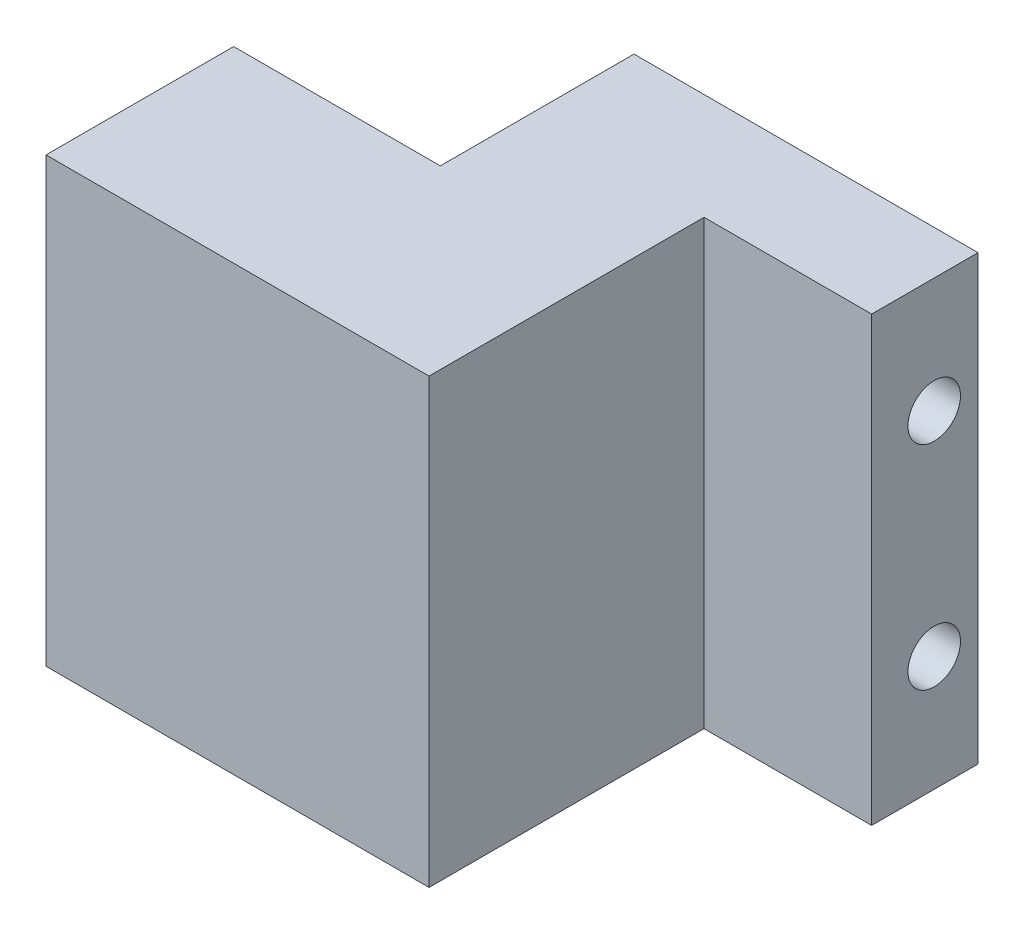
ISO-10303-21;
HEADER;
FILE_DESCRIPTION(('STEP AP214'),'2;1');
FILE_NAME('part.step','',(''),(''),'','','');
FILE_SCHEMA(('AUTOMOTIVE_DESIGN { 1 0 10303 214 1 1 1 1 }'));
ENDSEC;
DATA;
#1=APPLICATION_CONTEXT('core data for automotive mechanical design processes');
#2=APPLICATION_PROTOCOL_DEFINITION('international standard','automotive_design',2000,#1);
#3=PRODUCT_CONTEXT('',#1,'mechanical');
#4=PRODUCT('Part','Part','',(#3));
#5=PRODUCT_RELATED_PRODUCT_CATEGORY('part','',(#4));
#6=PRODUCT_DEFINITION_FORMATION('','',#4);
#7=PRODUCT_DEFINITION_CONTEXT('part definition',#1,'design');
#8=PRODUCT_DEFINITION('design','',#6,#7);
#9=PRODUCT_DEFINITION_SHAPE('','',#8);
#10=(LENGTH_UNIT() NAMED_UNIT(*) SI_UNIT(.MILLI.,.METRE.));
#11=(NAMED_UNIT(*) PLANE_ANGLE_UNIT() SI_UNIT($,.RADIAN.));
#12=(NAMED_UNIT(*) SI_UNIT($,.STERADIAN.) SOLID_ANGLE_UNIT());
#13=UNCERTAINTY_MEASURE_WITH_UNIT(LENGTH_MEASURE(1.E-05),#10,'distance_accuracy_value','');
#14=(GEOMETRIC_REPRESENTATION_CONTEXT(3) GLOBAL_UNCERTAINTY_ASSIGNED_CONTEXT((#13)) GLOBAL_UNIT_ASSIGNED_CONTEXT((#10,
#11,#12)) REPRESENTATION_CONTEXT('',''));
#15=CARTESIAN_POINT('',(0.,0.,0.));
#16=DIRECTION('',(0.,0.,1.));
#17=DIRECTION('',(1.,0.,0.));
#18=AXIS2_PLACEMENT_3D('',#15,#16,#17);
#19=CARTESIAN_POINT('',(1.01739170034459,35.4,-0.479999999999997));
#20=DIRECTION('',(-1.,0.,0.));
#21=DIRECTION('',(0.,0.,1.));
#22=AXIS2_PLACEMENT_3D('',#19,#20,#21);
#23=PLANE('',#22);
#24=DIRECTION('',(0.,0.,-1.));
#25=VECTOR('',#24,1.);
#26=CARTESIAN_POINT('',(1.01739170034459,0.,-0.479999999999997));
#27=LINE('',#26,#25);
#28=CARTESIAN_POINT('',(1.01739170034459,0.,8.02));
#29=VERTEX_POINT('',#28);
#30=CARTESIAN_POINT('',(1.01739170034459,0.,-0.479999999999997));
#31=VERTEX_POINT('',#30);
#32=EDGE_CURVE('E147',#29,#31,#27,.T.);
#33=ORIENTED_EDGE('',*,*,#32,.T.);
#34=DIRECTION('',(0.,-1.,0.));
#35=VECTOR('',#34,1.);
#36=CARTESIAN_POINT('',(1.01739170034459,35.4,-0.479999999999997));
#37=LINE('',#36,#35);
#38=CARTESIAN_POINT('',(1.01739170034459,35.4,-0.479999999999997));
#39=VERTEX_POINT('',#38);
#40=EDGE_CURVE('E41',#39,#31,#37,.T.);
#41=ORIENTED_EDGE('',*,*,#40,.F.);
#42=DIRECTION('',(0.,0.,-1.));
#43=VECTOR('',#42,1.);
#44=CARTESIAN_POINT('',(1.01739170034459,35.4,-0.479999999999997));
#45=LINE('',#44,#43);
#46=CARTESIAN_POINT('',(1.01739170034459,35.4,8.02));
#47=VERTEX_POINT('',#46);
#48=EDGE_CURVE('E100',#47,#39,#45,.T.);
#49=ORIENTED_EDGE('',*,*,#48,.F.);
#50=DIRECTION('',(0.,-1.,0.));
#51=VECTOR('',#50,1.);
#52=CARTESIAN_POINT('',(1.01739170034459,35.4,8.02));
#53=LINE('',#52,#51);
#54=EDGE_CURVE('E11',#47,#29,#53,.T.);
#55=ORIENTED_EDGE('',*,*,#54,.T.);
#56=EDGE_LOOP('',(#33,#41,#49,#55));
#57=FACE_BOUND('',#56,.T.);
#58=CARTESIAN_POINT('',(1.01739170034459,26.2,3.02));
#59=DIRECTION('',(1.,0.,0.));
#60=DIRECTION('',(0.,0.,-1.));
#61=AXIS2_PLACEMENT_3D('',#58,#59,#60);
#62=CIRCLE('',#61,2.1);
#63=CARTESIAN_POINT('',(1.01739170034459,26.2,0.920000000000002));
#64=VERTEX_POINT('',#63);
#65=EDGE_CURVE('E180',#64,#64,#62,.F.);
#66=ORIENTED_EDGE('',*,*,#65,.T.);
#67=EDGE_LOOP('',(#66));
#68=FACE_BOUND('',#67,.T.);
#69=CARTESIAN_POINT('',(1.01739170034459,9.2,3.02));
#70=DIRECTION('',(1.,0.,0.));
#71=DIRECTION('',(0.,0.,-1.));
#72=AXIS2_PLACEMENT_3D('',#69,#70,#71);
#73=CIRCLE('',#72,2.1);
#74=CARTESIAN_POINT('',(1.01739170034459,9.2,0.920000000000002));
#75=VERTEX_POINT('',#74);
#76=EDGE_CURVE('E175',#75,#75,#73,.T.);
#77=ORIENTED_EDGE('',*,*,#76,.F.);
#78=EDGE_LOOP('',(#77));
#79=FACE_BOUND('',#78,.T.);
#80=ADVANCED_FACE('F33',(#57,#68,#79),#23,.F.);
#81=CARTESIAN_POINT('',(-26.48,35.4,15.));
#82=DIRECTION('',(1.,0.,0.));
#83=DIRECTION('',(0.,0.,-1.));
#84=AXIS2_PLACEMENT_3D('',#81,#82,#83);
#85=PLANE('',#84);
#86=DIRECTION('',(0.,0.,1.));
#87=VECTOR('',#86,1.);
#88=CARTESIAN_POINT('',(-26.48,0.,15.));
#89=LINE('',#88,#87);
#90=CARTESIAN_POINT('',(-26.4799999999999,0.,-0.479999999999993));
#91=VERTEX_POINT('',#90);
#92=CARTESIAN_POINT('',(-26.48,0.,15.));
#93=VERTEX_POINT('',#92);
#94=EDGE_CURVE('E152',#91,#93,#89,.T.);
#95=ORIENTED_EDGE('',*,*,#94,.T.);
#96=DIRECTION('',(0.,-1.,0.));
#97=VECTOR('',#96,1.);
#98=CARTESIAN_POINT('',(-26.48,35.4,15.));
#99=LINE('',#98,#97);
#100=CARTESIAN_POINT('',(-26.48,35.4,15.));
#101=VERTEX_POINT('',#100);
#102=EDGE_CURVE('E166',#101,#93,#99,.T.);
#103=ORIENTED_EDGE('',*,*,#102,.F.);
#104=DIRECTION('',(0.,0.,1.));
#105=VECTOR('',#104,1.);
#106=CARTESIAN_POINT('',(-26.48,35.4,15.));
#107=LINE('',#106,#105);
#108=CARTESIAN_POINT('',(-26.4799999999999,35.4,-0.479999999999993));
#109=VERTEX_POINT('',#108);
#110=EDGE_CURVE('E222',#109,#101,#107,.T.);
#111=ORIENTED_EDGE('',*,*,#110,.F.);
#112=DIRECTION('',(0.,-1.,0.));
#113=VECTOR('',#112,1.);
#114=CARTESIAN_POINT('',(-26.4799999999999,35.4,-0.479999999999993));
#115=LINE('',#114,#113);
#116=EDGE_CURVE('E169',#109,#91,#115,.T.);
#117=ORIENTED_EDGE('',*,*,#116,.T.);
#118=EDGE_LOOP('',(#95,#103,#111,#117));
#119=FACE_BOUND('',#118,.T.);
#120=CARTESIAN_POINT('',(-26.4799999999999,26.2,3.02));
#121=DIRECTION('',(1.,0.,0.));
#122=DIRECTION('',(0.,0.,-1.));
#123=AXIS2_PLACEMENT_3D('',#120,#121,#122);
#124=CIRCLE('',#123,2.1);
#125=CARTESIAN_POINT('',(-26.4799999999999,26.2,0.920000000000002));
#126=VERTEX_POINT('',#125);
#127=EDGE_CURVE('E173',#126,#126,#124,.F.);
#128=ORIENTED_EDGE('',*,*,#127,.F.);
#129=EDGE_LOOP('',(#128));
#130=FACE_BOUND('',#129,.T.);
#131=CARTESIAN_POINT('',(-26.4799999999999,9.2,3.02));
#132=DIRECTION('',(1.,0.,0.));
#133=DIRECTION('',(0.,0.,-1.));
#134=AXIS2_PLACEMENT_3D('',#131,#132,#133);
#135=CIRCLE('',#134,2.1);
#136=CARTESIAN_POINT('',(-26.4799999999999,9.2,0.920000000000002));
#137=VERTEX_POINT('',#136);
#138=EDGE_CURVE('E36',#137,#137,#135,.T.);
#139=ORIENTED_EDGE('',*,*,#138,.T.);
#140=EDGE_LOOP('',(#139));
#141=FACE_BOUND('',#140,.T.);
#142=ADVANCED_FACE('F228',(#119,#130,#141),#85,.F.);
#143=CARTESIAN_POINT('',(1.01739170034459,35.4,-0.479999999999997));
#144=DIRECTION('',(0.,0.,1.));
#145=DIRECTION('',(1.,0.,0.));
#146=AXIS2_PLACEMENT_3D('',#143,#144,#145);
#147=PLANE('',#146);
#148=DIRECTION('',(-1.,0.,0.));
#149=VECTOR('',#148,1.);
#150=CARTESIAN_POINT('',(1.01739170034459,0.,-0.479999999999997));
#151=LINE('',#150,#149);
#152=EDGE_CURVE('E149',#31,#91,#151,.T.);
#153=ORIENTED_EDGE('',*,*,#152,.T.);
#154=ORIENTED_EDGE('',*,*,#116,.F.);
#155=DIRECTION('',(-1.,0.,0.));
#156=VECTOR('',#155,1.);
#157=CARTESIAN_POINT('',(1.01739170034459,35.4,-0.479999999999997));
#158=LINE('',#157,#156);
#159=EDGE_CURVE('E220',#39,#109,#158,.T.);
#160=ORIENTED_EDGE('',*,*,#159,.F.);
#161=ORIENTED_EDGE('',*,*,#40,.T.);
#162=EDGE_LOOP('',(#153,#154,#160,#161));
#163=FACE_BOUND('',#162,.T.);
#164=ADVANCED_FACE('F242',(#163),#147,.F.);
#165=CARTESIAN_POINT('',(-31.48,35.4,15.));
#166=DIRECTION('',(0.,0.,1.));
#167=DIRECTION('',(1.,0.,0.));
#168=AXIS2_PLACEMENT_3D('',#165,#166,#167);
#169=PLANE('',#168);
#170=DIRECTION('',(-1.,0.,0.));
#171=VECTOR('',#170,1.);
#172=CARTESIAN_POINT('',(-31.48,0.,15.));
#173=LINE('',#172,#171);
#174=CARTESIAN_POINT('',(-43.,0.,15.));
#175=VERTEX_POINT('',#174);
#176=EDGE_CURVE('E155',#93,#175,#173,.T.);
#177=ORIENTED_EDGE('',*,*,#176,.T.);
#178=DIRECTION('',(0.,-1.,0.));
#179=VECTOR('',#178,1.);
#180=CARTESIAN_POINT('',(-43.,35.4,15.));
#181=LINE('',#180,#179);
#182=CARTESIAN_POINT('',(-43.,35.4,15.));
#183=VERTEX_POINT('',#182);
#184=EDGE_CURVE('E136',#183,#175,#181,.T.);
#185=ORIENTED_EDGE('',*,*,#184,.F.);
#186=DIRECTION('',(-1.,0.,0.));
#187=VECTOR('',#186,1.);
#188=CARTESIAN_POINT('',(-31.48,35.4,15.));
#189=LINE('',#188,#187);
#190=EDGE_CURVE('E124',#101,#183,#189,.T.);
#191=ORIENTED_EDGE('',*,*,#190,.F.);
#192=ORIENTED_EDGE('',*,*,#102,.T.);
#193=EDGE_LOOP('',(#177,#185,#191,#192));
#194=FACE_BOUND('',#193,.T.);
#195=ADVANCED_FACE('F232',(#194),#169,.F.);
#196=CARTESIAN_POINT('',(-43.,35.4,15.));
#197=DIRECTION('',(1.,0.,0.));
#198=DIRECTION('',(0.,0.,-1.));
#199=AXIS2_PLACEMENT_3D('',#196,#197,#198);
#200=PLANE('',#199);
#201=DIRECTION('',(0.,0.,1.));
#202=VECTOR('',#201,1.);
#203=CARTESIAN_POINT('',(-42.9999999999999,4.92500000000001,26.815));
#204=LINE('',#203,#202);
#205=CARTESIAN_POINT('',(-43.,4.92500000000001,18.185));
#206=VERTEX_POINT('',#205);
#207=CARTESIAN_POINT('',(-42.9999999999999,4.92500000000001,26.815));
#208=VERTEX_POINT('',#207);
#209=EDGE_CURVE('E202',#206,#208,#204,.T.);
#210=ORIENTED_EDGE('',*,*,#209,.F.);
#211=DIRECTION('',(0.,-1.,0.));
#212=VECTOR('',#211,1.);
#213=CARTESIAN_POINT('',(-42.9999999999999,4.92500000000001,18.185));
#214=LINE('',#213,#212);
#215=CARTESIAN_POINT('',(-42.9999999999999,30.475,18.185));
#216=VERTEX_POINT('',#215);
#217=EDGE_CURVE('E49',#216,#206,#214,.T.);
#218=ORIENTED_EDGE('',*,*,#217,.F.);
#219=DIRECTION('',(0.,0.,-1.));
#220=VECTOR('',#219,1.);
#221=CARTESIAN_POINT('',(-42.9999999999999,30.475,26.815));
#222=LINE('',#221,#220);
#223=CARTESIAN_POINT('',(-42.9999999999999,30.475,26.815));
#224=VERTEX_POINT('',#223);
#225=EDGE_CURVE('E191',#224,#216,#222,.T.);
#226=ORIENTED_EDGE('',*,*,#225,.F.);
#227=DIRECTION('',(0.,1.,0.));
#228=VECTOR('',#227,1.);
#229=CARTESIAN_POINT('',(-42.9999999999999,4.92500000000001,26.815));
#230=LINE('',#229,#228);
#231=EDGE_CURVE('E205',#208,#224,#230,.T.);
#232=ORIENTED_EDGE('',*,*,#231,.F.);
#233=EDGE_LOOP('',(#210,#218,#226,#232));
#234=FACE_BOUND('',#233,.T.);
#235=DIRECTION('',(0.,0.,1.));
#236=VECTOR('',#235,1.);
#237=CARTESIAN_POINT('',(-43.,0.,15.));
#238=LINE('',#237,#236);
#239=CARTESIAN_POINT('',(-43.,0.,30.));
#240=VERTEX_POINT('',#239);
#241=EDGE_CURVE('E133',#175,#240,#238,.T.);
#242=ORIENTED_EDGE('',*,*,#241,.T.);
#243=DIRECTION('',(0.,-1.,0.));
#244=VECTOR('',#243,1.);
#245=CARTESIAN_POINT('',(-43.,35.4,30.));
#246=LINE('',#245,#244);
#247=CARTESIAN_POINT('',(-43.,35.4,30.));
#248=VERTEX_POINT('',#247);
#249=EDGE_CURVE('E130',#248,#240,#246,.T.);
#250=ORIENTED_EDGE('',*,*,#249,.F.);
#251=DIRECTION('',(0.,0.,1.));
#252=VECTOR('',#251,1.);
#253=CARTESIAN_POINT('',(-43.,35.4,15.));
#254=LINE('',#253,#252);
#255=EDGE_CURVE('E117',#183,#248,#254,.T.);
#256=ORIENTED_EDGE('',*,*,#255,.F.);
#257=ORIENTED_EDGE('',*,*,#184,.T.);
#258=EDGE_LOOP('',(#242,#250,#256,#257));
#259=FACE_BOUND('',#258,.T.);
#260=ADVANCED_FACE('F131',(#234,#259),#200,.F.);
#261=CARTESIAN_POINT('',(-43.,35.4,30.));
#262=DIRECTION('',(0.,0.,-1.));
#263=DIRECTION('',(-1.,0.,0.));
#264=AXIS2_PLACEMENT_3D('',#261,#262,#263);
#265=PLANE('',#264);
#266=DIRECTION('',(1.,0.,0.));
#267=VECTOR('',#266,1.);
#268=CARTESIAN_POINT('',(-43.,0.,30.));
#269=LINE('',#268,#267);
#270=CARTESIAN_POINT('',(-12.38,0.,30.));
#271=VERTEX_POINT('',#270);
#272=EDGE_CURVE('E158',#240,#271,#269,.T.);
#273=ORIENTED_EDGE('',*,*,#272,.T.);
#274=DIRECTION('',(0.,-1.,0.));
#275=VECTOR('',#274,1.);
#276=CARTESIAN_POINT('',(-12.38,35.4,30.));
#277=LINE('',#276,#275);
#278=CARTESIAN_POINT('',(-12.38,35.4,30.));
#279=VERTEX_POINT('',#278);
#280=EDGE_CURVE('E137',#279,#271,#277,.T.);
#281=ORIENTED_EDGE('',*,*,#280,.F.);
#282=DIRECTION('',(1.,0.,0.));
#283=VECTOR('',#282,1.);
#284=CARTESIAN_POINT('',(-43.,35.4,30.));
#285=LINE('',#284,#283);
#286=EDGE_CURVE('E121',#248,#279,#285,.T.);
#287=ORIENTED_EDGE('',*,*,#286,.F.);
#288=ORIENTED_EDGE('',*,*,#249,.T.);
#289=EDGE_LOOP('',(#273,#281,#287,#288));
#290=FACE_BOUND('',#289,.T.);
#291=ADVANCED_FACE('F139',(#290),#265,.F.);
#292=CARTESIAN_POINT('',(-12.38,35.4,30.));
#293=DIRECTION('',(-1.,0.,0.));
#294=DIRECTION('',(0.,0.,1.));
#295=AXIS2_PLACEMENT_3D('',#292,#293,#294);
#296=PLANE('',#295);
#297=DIRECTION('',(0.,0.,-1.));
#298=VECTOR('',#297,1.);
#299=CARTESIAN_POINT('',(-12.38,0.,30.));
#300=LINE('',#299,#298);
#301=CARTESIAN_POINT('',(-12.38,0.,8.02));
#302=VERTEX_POINT('',#301);
#303=EDGE_CURVE('E93',#271,#302,#300,.T.);
#304=ORIENTED_EDGE('',*,*,#303,.T.);
#305=DIRECTION('',(0.,-1.,0.));
#306=VECTOR('',#305,1.);
#307=CARTESIAN_POINT('',(-12.38,35.4,8.02));
#308=LINE('',#307,#306);
#309=CARTESIAN_POINT('',(-12.38,35.4,8.02));
#310=VERTEX_POINT('',#309);
#311=EDGE_CURVE('E143',#310,#302,#308,.T.);
#312=ORIENTED_EDGE('',*,*,#311,.F.);
#313=DIRECTION('',(0.,0.,-1.));
#314=VECTOR('',#313,1.);
#315=CARTESIAN_POINT('',(-12.38,35.4,30.));
#316=LINE('',#315,#314);
#317=EDGE_CURVE('E141',#279,#310,#316,.T.);
#318=ORIENTED_EDGE('',*,*,#317,.F.);
#319=ORIENTED_EDGE('',*,*,#280,.T.);
#320=EDGE_LOOP('',(#304,#312,#318,#319));
#321=FACE_BOUND('',#320,.T.);
#322=ADVANCED_FACE('F237',(#321),#296,.F.);
#323=CARTESIAN_POINT('',(-11.48,35.4,8.02));
#324=DIRECTION('',(0.,0.,-1.));
#325=DIRECTION('',(-1.,0.,0.));
#326=AXIS2_PLACEMENT_3D('',#323,#324,#325);
#327=PLANE('',#326);
#328=DIRECTION('',(1.,0.,0.));
#329=VECTOR('',#328,1.);
#330=CARTESIAN_POINT('',(-11.48,0.,8.02));
#331=LINE('',#330,#329);
#332=EDGE_CURVE('E161',#302,#29,#331,.T.);
#333=ORIENTED_EDGE('',*,*,#332,.T.);
#334=ORIENTED_EDGE('',*,*,#54,.F.);
#335=DIRECTION('',(1.,0.,0.));
#336=VECTOR('',#335,1.);
#337=CARTESIAN_POINT('',(-11.48,35.4,8.02));
#338=LINE('',#337,#336);
#339=EDGE_CURVE('E58',#310,#47,#338,.T.);
#340=ORIENTED_EDGE('',*,*,#339,.F.);
#341=ORIENTED_EDGE('',*,*,#311,.T.);
#342=EDGE_LOOP('',(#333,#334,#340,#341));
#343=FACE_BOUND('',#342,.T.);
#344=ADVANCED_FACE('F238',(#343),#327,.F.);
#345=CARTESIAN_POINT('',(0.,35.4,0.));
#346=DIRECTION('',(0.,-1.,0.));
#347=DIRECTION('',(0.,0.,-1.));
#348=AXIS2_PLACEMENT_3D('',#345,#346,#347);
#349=PLANE('',#348);
#350=ORIENTED_EDGE('',*,*,#339,.T.);
#351=ORIENTED_EDGE('',*,*,#48,.T.);
#352=ORIENTED_EDGE('',*,*,#159,.T.);
#353=ORIENTED_EDGE('',*,*,#110,.T.);
#354=ORIENTED_EDGE('',*,*,#190,.T.);
#355=ORIENTED_EDGE('',*,*,#255,.T.);
#356=ORIENTED_EDGE('',*,*,#286,.T.);
#357=ORIENTED_EDGE('',*,*,#317,.T.);
#358=EDGE_LOOP('',(#350,#351,#352,#353,#354,#355,#356,#357));
#359=FACE_BOUND('',#358,.T.);
#360=ADVANCED_FACE('F119',(#359),#349,.F.);
#361=CARTESIAN_POINT('',(0.,0.,0.));
#362=DIRECTION('',(0.,-1.,0.));
#363=DIRECTION('',(0.,0.,-1.));
#364=AXIS2_PLACEMENT_3D('',#361,#362,#363);
#365=PLANE('',#364);
#366=ORIENTED_EDGE('',*,*,#32,.F.);
#367=ORIENTED_EDGE('',*,*,#332,.F.);
#368=ORIENTED_EDGE('',*,*,#303,.F.);
#369=ORIENTED_EDGE('',*,*,#272,.F.);
#370=ORIENTED_EDGE('',*,*,#241,.F.);
#371=ORIENTED_EDGE('',*,*,#176,.F.);
#372=ORIENTED_EDGE('',*,*,#94,.F.);
#373=ORIENTED_EDGE('',*,*,#152,.F.);
#374=EDGE_LOOP('',(#366,#367,#368,#369,#370,#371,#372,#373));
#375=FACE_BOUND('',#374,.T.);
#376=ADVANCED_FACE('F235',(#375),#365,.T.);
#377=CARTESIAN_POINT('',(-12.9999999999999,4.92500000000001,18.185));
#378=DIRECTION('',(0.,0.,-1.));
#379=DIRECTION('',(-1.,0.,0.));
#380=AXIS2_PLACEMENT_3D('',#377,#378,#379);
#381=PLANE('',#380);
#382=ORIENTED_EDGE('',*,*,#217,.T.);
#383=DIRECTION('',(-1.,0.,0.));
#384=VECTOR('',#383,1.);
#385=CARTESIAN_POINT('',(-12.9999999999999,4.92500000000001,18.185));
#386=LINE('',#385,#384);
#387=CARTESIAN_POINT('',(-12.9999999999999,4.92500000000001,18.185));
#388=VERTEX_POINT('',#387);
#389=EDGE_CURVE('E200',#388,#206,#386,.T.);
#390=ORIENTED_EDGE('',*,*,#389,.F.);
#391=DIRECTION('',(0.,-1.,0.));
#392=VECTOR('',#391,1.);
#393=CARTESIAN_POINT('',(-12.9999999999999,4.92500000000001,18.185));
#394=LINE('',#393,#392);
#395=CARTESIAN_POINT('',(-12.9999999999999,30.475,18.185));
#396=VERTEX_POINT('',#395);
#397=EDGE_CURVE('E187',#396,#388,#394,.T.);
#398=ORIENTED_EDGE('',*,*,#397,.F.);
#399=DIRECTION('',(-1.,0.,0.));
#400=VECTOR('',#399,1.);
#401=CARTESIAN_POINT('',(-12.9999999999999,30.475,18.185));
#402=LINE('',#401,#400);
#403=EDGE_CURVE('E150',#396,#216,#402,.T.);
#404=ORIENTED_EDGE('',*,*,#403,.T.);
#405=EDGE_LOOP('',(#382,#390,#398,#404));
#406=FACE_BOUND('',#405,.T.);
#407=ADVANCED_FACE('F293',(#406),#381,.F.);
#408=CARTESIAN_POINT('',(-12.9999999999999,30.475,26.815));
#409=DIRECTION('',(0.,1.,0.));
#410=DIRECTION('',(0.,0.,1.));
#411=AXIS2_PLACEMENT_3D('',#408,#409,#410);
#412=PLANE('',#411);
#413=ORIENTED_EDGE('',*,*,#225,.T.);
#414=ORIENTED_EDGE('',*,*,#403,.F.);
#415=DIRECTION('',(0.,0.,-1.));
#416=VECTOR('',#415,1.);
#417=CARTESIAN_POINT('',(-12.9999999999999,30.475,26.815));
#418=LINE('',#417,#416);
#419=CARTESIAN_POINT('',(-12.9999999999999,30.475,26.815));
#420=VERTEX_POINT('',#419);
#421=EDGE_CURVE('E197',#420,#396,#418,.T.);
#422=ORIENTED_EDGE('',*,*,#421,.F.);
#423=DIRECTION('',(-1.,0.,0.));
#424=VECTOR('',#423,1.);
#425=CARTESIAN_POINT('',(-12.9999999999999,30.475,26.815));
#426=LINE('',#425,#424);
#427=EDGE_CURVE('E211',#420,#224,#426,.T.);
#428=ORIENTED_EDGE('',*,*,#427,.T.);
#429=EDGE_LOOP('',(#413,#414,#422,#428));
#430=FACE_BOUND('',#429,.T.);
#431=ADVANCED_FACE('F289',(#430),#412,.F.);
#432=CARTESIAN_POINT('',(-12.9999999999999,4.92500000000001,26.815));
#433=DIRECTION('',(0.,0.,1.));
#434=DIRECTION('',(0.,-1.,0.));
#435=AXIS2_PLACEMENT_3D('',#432,#433,#434);
#436=PLANE('',#435);
#437=ORIENTED_EDGE('',*,*,#231,.T.);
#438=ORIENTED_EDGE('',*,*,#427,.F.);
#439=DIRECTION('',(0.,1.,0.));
#440=VECTOR('',#439,1.);
#441=CARTESIAN_POINT('',(-12.9999999999999,4.92500000000001,26.815));
#442=LINE('',#441,#440);
#443=CARTESIAN_POINT('',(-12.9999999999999,4.92500000000001,26.815));
#444=VERTEX_POINT('',#443);
#445=EDGE_CURVE('E194',#444,#420,#442,.T.);
#446=ORIENTED_EDGE('',*,*,#445,.F.);
#447=DIRECTION('',(-1.,0.,0.));
#448=VECTOR('',#447,1.);
#449=CARTESIAN_POINT('',(-12.9999999999999,4.92500000000001,26.815));
#450=LINE('',#449,#448);
#451=EDGE_CURVE('E214',#444,#208,#450,.T.);
#452=ORIENTED_EDGE('',*,*,#451,.T.);
#453=EDGE_LOOP('',(#437,#438,#446,#452));
#454=FACE_BOUND('',#453,.T.);
#455=ADVANCED_FACE('F292',(#454),#436,.F.);
#456=CARTESIAN_POINT('',(-12.9999999999999,4.92500000000001,26.815));
#457=DIRECTION('',(0.,-1.,0.));
#458=DIRECTION('',(0.,0.,-1.));
#459=AXIS2_PLACEMENT_3D('',#456,#457,#458);
#460=PLANE('',#459);
#461=ORIENTED_EDGE('',*,*,#209,.T.);
#462=ORIENTED_EDGE('',*,*,#451,.F.);
#463=DIRECTION('',(0.,0.,1.));
#464=VECTOR('',#463,1.);
#465=CARTESIAN_POINT('',(-12.9999999999999,4.92500000000001,26.815));
#466=LINE('',#465,#464);
#467=EDGE_CURVE('E190',#388,#444,#466,.T.);
#468=ORIENTED_EDGE('',*,*,#467,.F.);
#469=ORIENTED_EDGE('',*,*,#389,.T.);
#470=EDGE_LOOP('',(#461,#462,#468,#469));
#471=FACE_BOUND('',#470,.T.);
#472=ADVANCED_FACE('F287',(#471),#460,.F.);
#473=CARTESIAN_POINT('',(-12.9999999999999,0.,0.));
#474=DIRECTION('',(-1.,0.,0.));
#475=DIRECTION('',(0.,0.,1.));
#476=AXIS2_PLACEMENT_3D('',#473,#474,#475);
#477=PLANE('',#476);
#478=ORIENTED_EDGE('',*,*,#397,.T.);
#479=ORIENTED_EDGE('',*,*,#467,.T.);
#480=ORIENTED_EDGE('',*,*,#445,.T.);
#481=ORIENTED_EDGE('',*,*,#421,.T.);
#482=EDGE_LOOP('',(#478,#479,#480,#481));
#483=FACE_BOUND('',#482,.T.);
#484=ADVANCED_FACE('F270',(#483),#477,.T.);
#485=CARTESIAN_POINT('',(-43.,26.2,3.02));
#486=DIRECTION('',(1.,0.,0.));
#487=DIRECTION('',(0.,0.,-1.));
#488=AXIS2_PLACEMENT_3D('',#485,#486,#487);
#489=CYLINDRICAL_SURFACE('',#488,2.1);
#490=ORIENTED_EDGE('',*,*,#65,.F.);
#491=EDGE_LOOP('',(#490));
#492=FACE_BOUND('',#491,.T.);
#493=ORIENTED_EDGE('',*,*,#127,.T.);
#494=EDGE_LOOP('',(#493));
#495=FACE_BOUND('',#494,.T.);
#496=ADVANCED_FACE('F264',(#492,#495),#489,.F.);
#497=CARTESIAN_POINT('',(-43.,9.2,3.02));
#498=DIRECTION('',(1.,0.,0.));
#499=DIRECTION('',(0.,0.,-1.));
#500=AXIS2_PLACEMENT_3D('',#497,#498,#499);
#501=CYLINDRICAL_SURFACE('',#500,2.1);
#502=ORIENTED_EDGE('',*,*,#76,.T.);
#503=EDGE_LOOP('',(#502));
#504=FACE_BOUND('',#503,.T.);
#505=ORIENTED_EDGE('',*,*,#138,.F.);
#506=EDGE_LOOP('',(#505));
#507=FACE_BOUND('',#506,.T.);
#508=ADVANCED_FACE('F269',(#504,#507),#501,.F.);
#509=CLOSED_SHELL('',(#80,#142,#164,#195,#260,#291,#322,#344,#360,#376,#407,#431,#455,#472,#484,
#496,#508));
#510=MANIFOLD_SOLID_BREP('B2',#509);
#511=ADVANCED_BREP_SHAPE_REPRESENTATION('',(#18,#510),#14);
#512=SHAPE_DEFINITION_REPRESENTATION(#9,#511);
ENDSEC;
END-ISO-10303-21;
